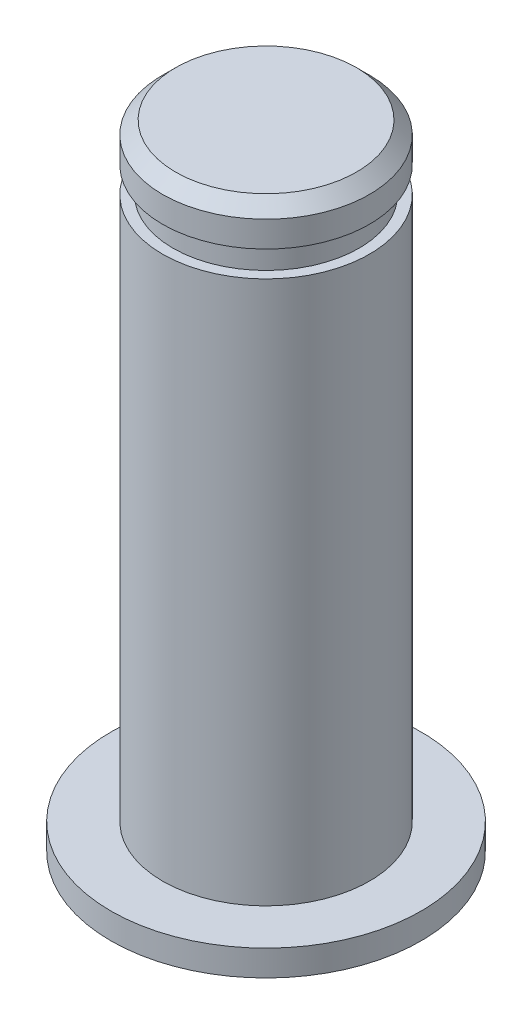
ISO-10303-21;
HEADER;
FILE_DESCRIPTION(('STEP AP214'),'2;1');
FILE_NAME('part.step','',(''),(''),'','','');
FILE_SCHEMA(('AUTOMOTIVE_DESIGN { 1 0 10303 214 1 1 1 1 }'));
ENDSEC;
DATA;
#1=APPLICATION_CONTEXT('core data for automotive mechanical design processes');
#2=APPLICATION_PROTOCOL_DEFINITION('international standard','automotive_design',2000,#1);
#3=PRODUCT_CONTEXT('',#1,'mechanical');
#4=PRODUCT('Part','Part','',(#3));
#5=PRODUCT_RELATED_PRODUCT_CATEGORY('part','',(#4));
#6=PRODUCT_DEFINITION_FORMATION('','',#4);
#7=PRODUCT_DEFINITION_CONTEXT('part definition',#1,'design');
#8=PRODUCT_DEFINITION('design','',#6,#7);
#9=PRODUCT_DEFINITION_SHAPE('','',#8);
#10=(LENGTH_UNIT() NAMED_UNIT(*) SI_UNIT(.MILLI.,.METRE.));
#11=(NAMED_UNIT(*) PLANE_ANGLE_UNIT() SI_UNIT($,.RADIAN.));
#12=(NAMED_UNIT(*) SI_UNIT($,.STERADIAN.) SOLID_ANGLE_UNIT());
#13=UNCERTAINTY_MEASURE_WITH_UNIT(LENGTH_MEASURE(1.E-05),#10,'distance_accuracy_value','');
#14=(GEOMETRIC_REPRESENTATION_CONTEXT(3) GLOBAL_UNCERTAINTY_ASSIGNED_CONTEXT((#13)) GLOBAL_UNIT_ASSIGNED_CONTEXT((#10,
#11,#12)) REPRESENTATION_CONTEXT('',''));
#15=CARTESIAN_POINT('',(0.,0.,0.));
#16=DIRECTION('',(0.,0.,1.));
#17=DIRECTION('',(1.,0.,0.));
#18=AXIS2_PLACEMENT_3D('',#15,#16,#17);
#19=CARTESIAN_POINT('',(0.,0.,0.));
#20=DIRECTION('',(0.,1.,0.));
#21=DIRECTION('',(0.,0.,1.));
#22=AXIS2_PLACEMENT_3D('',#19,#20,#21);
#23=CYLINDRICAL_SURFACE('',#22,4.00000000000009);
#24=CARTESIAN_POINT('',(0.,23.9999999999986,0.));
#25=DIRECTION('',(0.,1.,0.));
#26=DIRECTION('',(0.,0.,1.));
#27=AXIS2_PLACEMENT_3D('',#24,#25,#26);
#28=CIRCLE('',#27,4.00000000000009);
#29=CARTESIAN_POINT('',(0.,23.9999999999986,4.00000000000009));
#30=VERTEX_POINT('',#29);
#31=EDGE_CURVE('E10',#30,#30,#28,.F.);
#32=ORIENTED_EDGE('',*,*,#31,.T.);
#33=EDGE_LOOP('',(#32));
#34=FACE_BOUND('',#33,.T.);
#35=CARTESIAN_POINT('',(0.,22.9999999999986,0.));
#36=DIRECTION('',(0.,1.,0.));
#37=DIRECTION('',(0.,0.,1.));
#38=AXIS2_PLACEMENT_3D('',#35,#36,#37);
#39=CIRCLE('',#38,4.00000000000009);
#40=CARTESIAN_POINT('',(0.,22.9999999999986,4.00000000000009));
#41=VERTEX_POINT('',#40);
#42=EDGE_CURVE('E66',#41,#41,#39,.T.);
#43=ORIENTED_EDGE('',*,*,#42,.T.);
#44=EDGE_LOOP('',(#43));
#45=FACE_BOUND('',#44,.T.);
#46=ADVANCED_FACE('F33',(#34,#45),#23,.T.);
#47=CARTESIAN_POINT('',(-4.00000000000009,24.4999999999986,0.));
#48=DIRECTION('',(0.,1.,0.));
#49=DIRECTION('',(0.,0.,1.));
#50=AXIS2_PLACEMENT_3D('',#47,#48,#49);
#51=PLANE('',#50);
#52=CARTESIAN_POINT('',(0.,24.4999999999986,0.));
#53=DIRECTION('',(0.,1.,0.));
#54=DIRECTION('',(0.,0.,1.));
#55=AXIS2_PLACEMENT_3D('',#52,#53,#54);
#56=CIRCLE('',#55,3.50000000000009);
#57=CARTESIAN_POINT('',(0.,24.4999999999986,3.50000000000009));
#58=VERTEX_POINT('',#57);
#59=EDGE_CURVE('E41',#58,#58,#56,.T.);
#60=ORIENTED_EDGE('',*,*,#59,.T.);
#61=EDGE_LOOP('',(#60));
#62=FACE_BOUND('',#61,.T.);
#63=ADVANCED_FACE('F85',(#62),#51,.T.);
#64=CARTESIAN_POINT('',(0.,0.,0.));
#65=DIRECTION('',(0.,-1.,0.));
#66=DIRECTION('',(0.,0.,-1.));
#67=AXIS2_PLACEMENT_3D('',#64,#65,#66);
#68=PLANE('',#67);
#69=CARTESIAN_POINT('',(0.,0.,0.));
#70=DIRECTION('',(0.,1.,0.));
#71=DIRECTION('',(0.,0.,1.));
#72=AXIS2_PLACEMENT_3D('',#69,#70,#71);
#73=CIRCLE('',#72,6.00000000000009);
#74=CARTESIAN_POINT('',(0.,0.,6.00000000000009));
#75=VERTEX_POINT('',#74);
#76=EDGE_CURVE('E45',#75,#75,#73,.T.);
#77=ORIENTED_EDGE('',*,*,#76,.F.);
#78=EDGE_LOOP('',(#77));
#79=FACE_BOUND('',#78,.T.);
#80=ADVANCED_FACE('F89',(#79),#68,.T.);
#81=CARTESIAN_POINT('',(0.,0.,0.));
#82=DIRECTION('',(0.,1.,0.));
#83=DIRECTION('',(0.,0.,1.));
#84=AXIS2_PLACEMENT_3D('',#81,#82,#83);
#85=CYLINDRICAL_SURFACE('',#84,6.00000000000009);
#86=ORIENTED_EDGE('',*,*,#76,.T.);
#87=EDGE_LOOP('',(#86));
#88=FACE_BOUND('',#87,.T.);
#89=CARTESIAN_POINT('',(0.,0.999999999999999,0.));
#90=DIRECTION('',(0.,1.,0.));
#91=DIRECTION('',(0.,0.,1.));
#92=AXIS2_PLACEMENT_3D('',#89,#90,#91);
#93=CIRCLE('',#92,6.00000000000009);
#94=CARTESIAN_POINT('',(0.,0.999999999999999,6.00000000000009));
#95=VERTEX_POINT('',#94);
#96=EDGE_CURVE('E49',#95,#95,#93,.T.);
#97=ORIENTED_EDGE('',*,*,#96,.F.);
#98=EDGE_LOOP('',(#97));
#99=FACE_BOUND('',#98,.T.);
#100=ADVANCED_FACE('F94',(#88,#99),#85,.T.);
#101=CARTESIAN_POINT('',(-6.00000000000009,0.999999999999999,0.));
#102=DIRECTION('',(0.,1.,0.));
#103=DIRECTION('',(0.,0.,1.));
#104=AXIS2_PLACEMENT_3D('',#101,#102,#103);
#105=PLANE('',#104);
#106=ORIENTED_EDGE('',*,*,#96,.T.);
#107=EDGE_LOOP('',(#106));
#108=FACE_BOUND('',#107,.T.);
#109=CARTESIAN_POINT('',(0.,0.999999999999999,0.));
#110=DIRECTION('',(0.,1.,0.));
#111=DIRECTION('',(0.,0.,1.));
#112=AXIS2_PLACEMENT_3D('',#109,#110,#111);
#113=CIRCLE('',#112,4.00000000000009);
#114=CARTESIAN_POINT('',(0.,0.999999999999999,4.00000000000009));
#115=VERTEX_POINT('',#114);
#116=EDGE_CURVE('E54',#115,#115,#113,.T.);
#117=ORIENTED_EDGE('',*,*,#116,.F.);
#118=EDGE_LOOP('',(#117));
#119=FACE_BOUND('',#118,.T.);
#120=ADVANCED_FACE('F98',(#108,#119),#105,.T.);
#121=CARTESIAN_POINT('',(0.,0.,0.));
#122=DIRECTION('',(0.,1.,0.));
#123=DIRECTION('',(0.,0.,1.));
#124=AXIS2_PLACEMENT_3D('',#121,#122,#123);
#125=CYLINDRICAL_SURFACE('',#124,4.00000000000009);
#126=ORIENTED_EDGE('',*,*,#116,.T.);
#127=EDGE_LOOP('',(#126));
#128=FACE_BOUND('',#127,.T.);
#129=CARTESIAN_POINT('',(0.,22.0000000000003,0.));
#130=DIRECTION('',(0.,1.,0.));
#131=DIRECTION('',(0.,0.,1.));
#132=AXIS2_PLACEMENT_3D('',#129,#130,#131);
#133=CIRCLE('',#132,4.00000000000009);
#134=CARTESIAN_POINT('',(0.,22.0000000000003,4.00000000000009));
#135=VERTEX_POINT('',#134);
#136=EDGE_CURVE('E57',#135,#135,#133,.T.);
#137=ORIENTED_EDGE('',*,*,#136,.F.);
#138=EDGE_LOOP('',(#137));
#139=FACE_BOUND('',#138,.T.);
#140=ADVANCED_FACE('F102',(#128,#139),#125,.T.);
#141=CARTESIAN_POINT('',(-4.00000000000009,21.9999999999994,0.));
#142=DIRECTION('',(0.,1.,0.));
#143=DIRECTION('',(0.,0.,1.));
#144=AXIS2_PLACEMENT_3D('',#141,#142,#143);
#145=PLANE('',#144);
#146=ORIENTED_EDGE('',*,*,#136,.T.);
#147=EDGE_LOOP('',(#146));
#148=FACE_BOUND('',#147,.T.);
#149=CARTESIAN_POINT('',(0.,21.9999999999986,0.));
#150=DIRECTION('',(0.,1.,0.));
#151=DIRECTION('',(0.,0.,1.));
#152=AXIS2_PLACEMENT_3D('',#149,#150,#151);
#153=CIRCLE('',#152,3.60000000000047);
#154=CARTESIAN_POINT('',(0.,21.9999999999986,3.60000000000047));
#155=VERTEX_POINT('',#154);
#156=EDGE_CURVE('E60',#155,#155,#153,.T.);
#157=ORIENTED_EDGE('',*,*,#156,.F.);
#158=EDGE_LOOP('',(#157));
#159=FACE_BOUND('',#158,.T.);
#160=ADVANCED_FACE('F81',(#148,#159),#145,.T.);
#161=CARTESIAN_POINT('',(0.,0.,0.));
#162=DIRECTION('',(0.,1.,0.));
#163=DIRECTION('',(0.,0.,1.));
#164=AXIS2_PLACEMENT_3D('',#161,#162,#163);
#165=CYLINDRICAL_SURFACE('',#164,3.60000000000047);
#166=ORIENTED_EDGE('',*,*,#156,.T.);
#167=EDGE_LOOP('',(#166));
#168=FACE_BOUND('',#167,.T.);
#169=CARTESIAN_POINT('',(0.,22.9999999999986,0.));
#170=DIRECTION('',(0.,1.,0.));
#171=DIRECTION('',(0.,0.,1.));
#172=AXIS2_PLACEMENT_3D('',#169,#170,#171);
#173=CIRCLE('',#172,3.60000000000047);
#174=CARTESIAN_POINT('',(0.,22.9999999999986,3.60000000000047));
#175=VERTEX_POINT('',#174);
#176=EDGE_CURVE('E63',#175,#175,#173,.T.);
#177=ORIENTED_EDGE('',*,*,#176,.F.);
#178=EDGE_LOOP('',(#177));
#179=FACE_BOUND('',#178,.T.);
#180=ADVANCED_FACE('F73',(#168,#179),#165,.T.);
#181=CARTESIAN_POINT('',(-3.60000000000047,22.9999999999986,0.));
#182=DIRECTION('',(0.,-1.,0.));
#183=DIRECTION('',(0.,0.,-1.));
#184=AXIS2_PLACEMENT_3D('',#181,#182,#183);
#185=PLANE('',#184);
#186=ORIENTED_EDGE('',*,*,#176,.T.);
#187=EDGE_LOOP('',(#186));
#188=FACE_BOUND('',#187,.T.);
#189=ORIENTED_EDGE('',*,*,#42,.F.);
#190=EDGE_LOOP('',(#189));
#191=FACE_BOUND('',#190,.T.);
#192=ADVANCED_FACE('F71',(#188,#191),#185,.T.);
#193=CARTESIAN_POINT('',(0.,24.4999999999986,0.));
#194=DIRECTION('',(0.,-1.,0.));
#195=DIRECTION('',(0.,0.,-1.));
#196=AXIS2_PLACEMENT_3D('',#193,#194,#195);
#197=CONICAL_SURFACE('',#196,3.50000000000009,0.785398163397443);
#198=ORIENTED_EDGE('',*,*,#31,.F.);
#199=EDGE_LOOP('',(#198));
#200=FACE_BOUND('',#199,.T.);
#201=ORIENTED_EDGE('',*,*,#59,.F.);
#202=EDGE_LOOP('',(#201));
#203=FACE_BOUND('',#202,.T.);
#204=ADVANCED_FACE('F36',(#200,#203),#197,.T.);
#205=CLOSED_SHELL('',(#46,#63,#80,#100,#120,#140,#160,#180,#192,#204));
#206=MANIFOLD_SOLID_BREP('B2',#205);
#207=ADVANCED_BREP_SHAPE_REPRESENTATION('',(#18,#206),#14);
#208=SHAPE_DEFINITION_REPRESENTATION(#9,#207);
ENDSEC;
END-ISO-10303-21;
